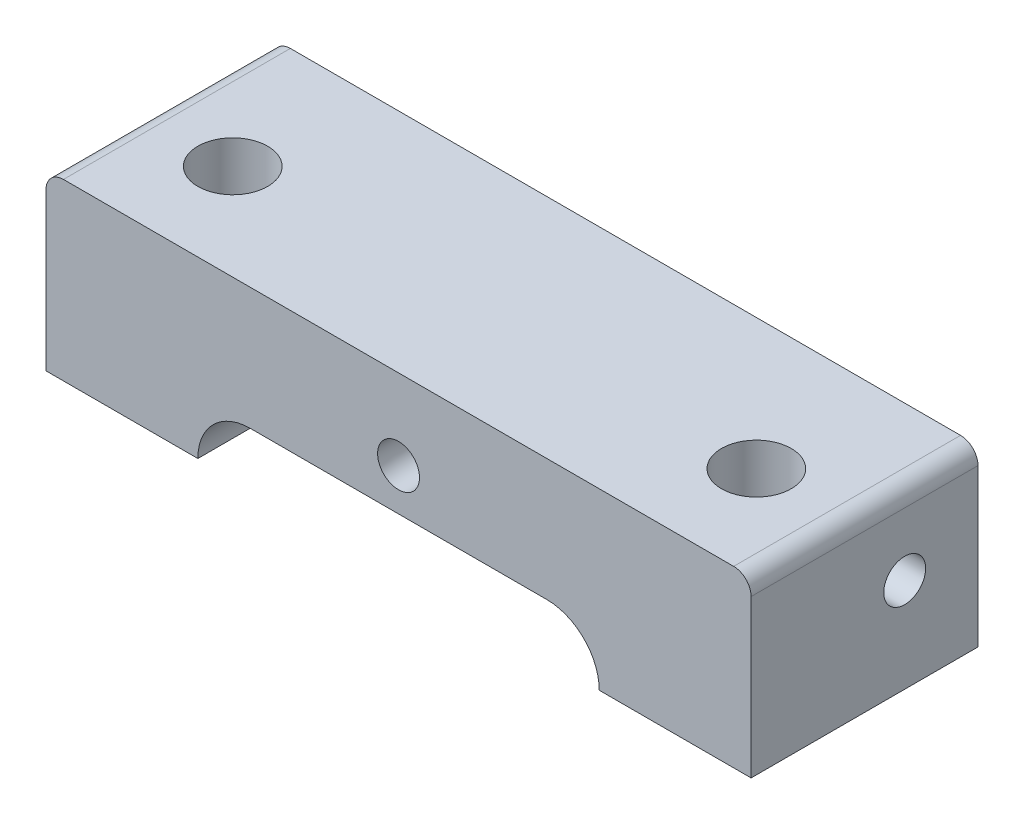
ISO-10303-21;
HEADER;
FILE_DESCRIPTION(('STEP AP214'),'2;1');
FILE_NAME('part.step','',(''),(''),'','','');
FILE_SCHEMA(('AUTOMOTIVE_DESIGN { 1 0 10303 214 1 1 1 1 }'));
ENDSEC;
DATA;
#1=APPLICATION_CONTEXT('core data for automotive mechanical design processes');
#2=APPLICATION_PROTOCOL_DEFINITION('international standard','automotive_design',2000,#1);
#3=PRODUCT_CONTEXT('',#1,'mechanical');
#4=PRODUCT('Part','Part','',(#3));
#5=PRODUCT_RELATED_PRODUCT_CATEGORY('part','',(#4));
#6=PRODUCT_DEFINITION_FORMATION('','',#4);
#7=PRODUCT_DEFINITION_CONTEXT('part definition',#1,'design');
#8=PRODUCT_DEFINITION('design','',#6,#7);
#9=PRODUCT_DEFINITION_SHAPE('','',#8);
#10=(LENGTH_UNIT() NAMED_UNIT(*) SI_UNIT(.MILLI.,.METRE.));
#11=(NAMED_UNIT(*) PLANE_ANGLE_UNIT() SI_UNIT($,.RADIAN.));
#12=(NAMED_UNIT(*) SI_UNIT($,.STERADIAN.) SOLID_ANGLE_UNIT());
#13=UNCERTAINTY_MEASURE_WITH_UNIT(LENGTH_MEASURE(1.E-05),#10,'distance_accuracy_value','');
#14=(GEOMETRIC_REPRESENTATION_CONTEXT(3) GLOBAL_UNCERTAINTY_ASSIGNED_CONTEXT((#13)) GLOBAL_UNIT_ASSIGNED_CONTEXT((#10,
#11,#12)) REPRESENTATION_CONTEXT('',''));
#15=CARTESIAN_POINT('',(0.,0.,0.));
#16=DIRECTION('',(0.,0.,1.));
#17=DIRECTION('',(1.,0.,0.));
#18=AXIS2_PLACEMENT_3D('',#15,#16,#17);
#19=CARTESIAN_POINT('',(0.,25.4,0.));
#20=DIRECTION('',(0.,1.,0.));
#21=DIRECTION('',(0.,0.,1.));
#22=AXIS2_PLACEMENT_3D('',#19,#20,#21);
#23=PLANE('',#22);
#24=CARTESIAN_POINT('',(9.525,25.4,0.635));
#25=DIRECTION('',(0.,1.,0.));
#26=DIRECTION('',(0.,0.,1.));
#27=AXIS2_PLACEMENT_3D('',#24,#25,#26);
#28=CIRCLE('',#27,1.27);
#29=CARTESIAN_POINT('',(9.525,25.4,1.905));
#30=VERTEX_POINT('',#29);
#31=EDGE_CURVE('E179',#30,#30,#28,.F.);
#32=ORIENTED_EDGE('',*,*,#31,.F.);
#33=EDGE_LOOP('',(#32));
#34=FACE_BOUND('',#33,.T.);
#35=DIRECTION('',(1.,0.,0.));
#36=VECTOR('',#35,1.);
#37=CARTESIAN_POINT('',(-12.827,25.4,4.1275));
#38=LINE('',#37,#36);
#39=CARTESIAN_POINT('',(7.3025,25.4,4.1275));
#40=VERTEX_POINT('',#39);
#41=CARTESIAN_POINT('',(12.827,25.4,4.1275));
#42=VERTEX_POINT('',#41);
#43=EDGE_CURVE('E187',#40,#42,#38,.T.);
#44=ORIENTED_EDGE('',*,*,#43,.F.);
#45=DIRECTION('',(0.,0.,-1.));
#46=VECTOR('',#45,1.);
#47=CARTESIAN_POINT('',(7.3025,25.4,21.2725));
#48=LINE('',#47,#46);
#49=CARTESIAN_POINT('',(7.3025,25.4,-4.1275));
#50=VERTEX_POINT('',#49);
#51=EDGE_CURVE('E182',#50,#40,#48,.F.);
#52=ORIENTED_EDGE('',*,*,#51,.F.);
#53=DIRECTION('',(-1.,0.,0.));
#54=VECTOR('',#53,1.);
#55=CARTESIAN_POINT('',(-12.827,25.4,-4.1275));
#56=LINE('',#55,#54);
#57=CARTESIAN_POINT('',(12.827,25.4,-4.1275));
#58=VERTEX_POINT('',#57);
#59=EDGE_CURVE('E41',#58,#50,#56,.T.);
#60=ORIENTED_EDGE('',*,*,#59,.F.);
#61=DIRECTION('',(0.,0.,-1.));
#62=VECTOR('',#61,1.);
#63=CARTESIAN_POINT('',(12.827,25.4,4.1275));
#64=LINE('',#63,#62);
#65=EDGE_CURVE('E11',#42,#58,#64,.T.);
#66=ORIENTED_EDGE('',*,*,#65,.F.);
#67=EDGE_LOOP('',(#44,#52,#60,#66));
#68=FACE_BOUND('',#67,.T.);
#69=ADVANCED_FACE('F32',(#34,#68),#23,.F.);
#70=CARTESIAN_POINT('',(-9.525,25.4,0.635));
#71=DIRECTION('',(0.,1.,0.));
#72=DIRECTION('',(0.,0.,1.));
#73=AXIS2_PLACEMENT_3D('',#70,#71,#72);
#74=CIRCLE('',#73,1.27);
#75=CARTESIAN_POINT('',(-9.525,25.4,1.905));
#76=VERTEX_POINT('',#75);
#77=EDGE_CURVE('E176',#76,#76,#74,.F.);
#78=ORIENTED_EDGE('',*,*,#77,.F.);
#79=EDGE_LOOP('',(#78));
#80=FACE_BOUND('',#79,.T.);
#81=DIRECTION('',(0.,0.,-1.));
#82=VECTOR('',#81,1.);
#83=CARTESIAN_POINT('',(-7.3025,25.4,21.2725));
#84=LINE('',#83,#82);
#85=CARTESIAN_POINT('',(-7.3025,25.4,4.1275));
#86=VERTEX_POINT('',#85);
#87=CARTESIAN_POINT('',(-7.3025,25.4,-4.1275));
#88=VERTEX_POINT('',#87);
#89=EDGE_CURVE('E184',#86,#88,#84,.T.);
#90=ORIENTED_EDGE('',*,*,#89,.F.);
#91=CARTESIAN_POINT('',(-12.827,25.4,4.1275));
#92=VERTEX_POINT('',#91);
#93=EDGE_CURVE('E185',#92,#86,#38,.T.);
#94=ORIENTED_EDGE('',*,*,#93,.F.);
#95=DIRECTION('',(0.,0.,1.));
#96=VECTOR('',#95,1.);
#97=CARTESIAN_POINT('',(-12.827,25.4,4.1275));
#98=LINE('',#97,#96);
#99=CARTESIAN_POINT('',(-12.827,25.4,-4.1275));
#100=VERTEX_POINT('',#99);
#101=EDGE_CURVE('E36',#100,#92,#98,.T.);
#102=ORIENTED_EDGE('',*,*,#101,.F.);
#103=EDGE_CURVE('E55',#88,#100,#56,.T.);
#104=ORIENTED_EDGE('',*,*,#103,.F.);
#105=EDGE_LOOP('',(#90,#94,#102,#104));
#106=FACE_BOUND('',#105,.T.);
#107=ADVANCED_FACE('F34',(#80,#106),#23,.F.);
#108=CARTESIAN_POINT('',(-12.828,28.829,-1.4605));
#109=DIRECTION('',(1.,0.,0.));
#110=DIRECTION('',(0.,0.,-1.));
#111=AXIS2_PLACEMENT_3D('',#108,#109,#110);
#112=CYLINDRICAL_SURFACE('',#111,0.762);
#113=CARTESIAN_POINT('',(5.58800000000002,28.829,-1.4605));
#114=DIRECTION('',(-1.,0.,0.));
#115=DIRECTION('',(0.,0.,1.));
#116=AXIS2_PLACEMENT_3D('',#113,#114,#115);
#117=CIRCLE('',#116,0.762);
#118=CARTESIAN_POINT('',(5.58800000000002,28.829,-2.2225));
#119=VERTEX_POINT('',#118);
#120=EDGE_CURVE('E221',#119,#119,#117,.F.);
#121=CARTESIAN_POINT('',(12.827,28.829,-1.4605));
#122=DIRECTION('',(1.,0.,0.));
#123=DIRECTION('',(0.,0.,-1.));
#124=AXIS2_PLACEMENT_3D('',#121,#122,#123);
#125=CIRCLE('',#124,0.762);
#126=CARTESIAN_POINT('',(12.827,28.829,-2.2225));
#127=VERTEX_POINT('',#126);
#128=EDGE_CURVE('E224',#127,#127,#125,.T.);
#129=CARTESIAN_POINT('',(5.58800000000002,28.829,-2.2225));
#130=CARTESIAN_POINT('',(5.66340625000003,28.829,-2.2225));
#131=CARTESIAN_POINT('',(5.73881250000002,28.829,-2.2225));
#132=CARTESIAN_POINT('',(5.88962500000003,28.829,-2.2225));
#133=CARTESIAN_POINT('',(5.96503125000002,28.829,-2.2225));
#134=CARTESIAN_POINT('',(6.11584375000002,28.829,-2.2225));
#135=CARTESIAN_POINT('',(6.19125000000002,28.829,-2.2225));
#136=CARTESIAN_POINT('',(6.34206250000002,28.829,-2.2225));
#137=CARTESIAN_POINT('',(6.41746875000002,28.829,-2.2225));
#138=CARTESIAN_POINT('',(6.56828125000002,28.829,-2.2225));
#139=CARTESIAN_POINT('',(6.64368750000002,28.829,-2.2225));
#140=CARTESIAN_POINT('',(6.79450000000002,28.829,-2.2225));
#141=CARTESIAN_POINT('',(6.86990625000002,28.829,-2.2225));
#142=CARTESIAN_POINT('',(7.02071875000002,28.829,-2.2225));
#143=CARTESIAN_POINT('',(7.09612500000002,28.829,-2.2225));
#144=CARTESIAN_POINT('',(7.24693750000002,28.829,-2.2225));
#145=CARTESIAN_POINT('',(7.32234375000002,28.829,-2.2225));
#146=CARTESIAN_POINT('',(7.47315625000002,28.829,-2.2225));
#147=CARTESIAN_POINT('',(7.54856250000002,28.829,-2.2225));
#148=CARTESIAN_POINT('',(7.69937500000002,28.829,-2.2225));
#149=CARTESIAN_POINT('',(7.77478125000002,28.829,-2.2225));
#150=CARTESIAN_POINT('',(7.92559375000002,28.829,-2.2225));
#151=CARTESIAN_POINT('',(8.00100000000002,28.829,-2.2225));
#152=CARTESIAN_POINT('',(8.15181250000001,28.829,-2.2225));
#153=CARTESIAN_POINT('',(8.22721875000001,28.829,-2.2225));
#154=CARTESIAN_POINT('',(8.37803125000001,28.829,-2.2225));
#155=CARTESIAN_POINT('',(8.45343750000001,28.829,-2.2225));
#156=CARTESIAN_POINT('',(8.60425000000001,28.829,-2.2225));
#157=CARTESIAN_POINT('',(8.67965625000001,28.829,-2.2225));
#158=CARTESIAN_POINT('',(8.83046875000001,28.829,-2.2225));
#159=CARTESIAN_POINT('',(8.90587500000001,28.829,-2.2225));
#160=CARTESIAN_POINT('',(9.05668750000001,28.829,-2.2225));
#161=CARTESIAN_POINT('',(9.13209375000001,28.829,-2.2225));
#162=CARTESIAN_POINT('',(9.28290625000001,28.829,-2.2225));
#163=CARTESIAN_POINT('',(9.35831250000001,28.829,-2.2225));
#164=CARTESIAN_POINT('',(9.50912500000001,28.829,-2.2225));
#165=CARTESIAN_POINT('',(9.58453125000001,28.829,-2.2225));
#166=CARTESIAN_POINT('',(9.73534375000001,28.829,-2.2225));
#167=CARTESIAN_POINT('',(9.81075000000001,28.829,-2.2225));
#168=CARTESIAN_POINT('',(9.9615625,28.829,-2.2225));
#169=CARTESIAN_POINT('',(10.03696875,28.829,-2.2225));
#170=CARTESIAN_POINT('',(10.18778125,28.829,-2.2225));
#171=CARTESIAN_POINT('',(10.2631875,28.829,-2.2225));
#172=CARTESIAN_POINT('',(10.414,28.829,-2.2225));
#173=CARTESIAN_POINT('',(10.48940625,28.829,-2.2225));
#174=CARTESIAN_POINT('',(10.64021875,28.829,-2.2225));
#175=CARTESIAN_POINT('',(10.715625,28.829,-2.2225));
#176=CARTESIAN_POINT('',(10.8664375,28.829,-2.2225));
#177=CARTESIAN_POINT('',(10.94184375,28.829,-2.2225));
#178=CARTESIAN_POINT('',(11.09265625,28.829,-2.2225));
#179=CARTESIAN_POINT('',(11.1680625,28.829,-2.2225));
#180=CARTESIAN_POINT('',(11.318875,28.829,-2.2225));
#181=CARTESIAN_POINT('',(11.39428125,28.829,-2.2225));
#182=CARTESIAN_POINT('',(11.54509375,28.829,-2.2225));
#183=CARTESIAN_POINT('',(11.6205,28.829,-2.2225));
#184=CARTESIAN_POINT('',(11.7713125,28.829,-2.2225));
#185=CARTESIAN_POINT('',(11.84671875,28.829,-2.2225));
#186=CARTESIAN_POINT('',(11.99753125,28.829,-2.2225));
#187=CARTESIAN_POINT('',(12.0729375,28.829,-2.2225));
#188=CARTESIAN_POINT('',(12.22375,28.829,-2.2225));
#189=CARTESIAN_POINT('',(12.29915625,28.829,-2.2225));
#190=CARTESIAN_POINT('',(12.44996875,28.829,-2.2225));
#191=CARTESIAN_POINT('',(12.525375,28.829,-2.2225));
#192=CARTESIAN_POINT('',(12.6761875,28.829,-2.2225));
#193=CARTESIAN_POINT('',(12.75159375,28.829,-2.2225));
#194=CARTESIAN_POINT('',(12.827,28.829,-2.2225));
#195=B_SPLINE_CURVE_WITH_KNOTS('',3,(#129,#130,#131,#132,#133,#134,#135,#136,#137,#138,#139,
#140,#141,#142,#143,#144,#145,#146,#147,#148,#149,#150,#151,#152,#153,#154,#155,#156,#157,#158,
#159,#160,#161,#162,#163,#164,#165,#166,#167,#168,#169,#170,#171,#172,#173,#174,#175,#176,#177,
#178,#179,#180,#181,#182,#183,#184,#185,#186,#187,#188,#189,#190,#191,#192,#193,#194),
.UNSPECIFIED.,.F.,.F.,(4,2,2,2,2,2,2,2,2,2,2,2,2,2,2,2,2,2,2,2,2,2,2,2,2,2,2,2,2,2,2,2,4),(0.,
0.22621875,0.4524375,0.678656249999996,0.904874999999996,1.13109375,1.35731249999999,
1.58353124999999,1.80974999999999,2.03596874999999,2.26218749999999,2.48840624999999,
2.71462499999999,2.94084374999999,3.16706249999998,3.39328124999998,3.61949999999998,
3.84571874999998,4.07193749999998,4.29815624999998,4.52437499999998,4.75059374999998,
4.97681249999998,5.20303124999998,5.42924999999998,5.65546874999998,5.88168749999998,
6.10790624999997,6.33412499999997,6.56034374999997,6.78656249999997,7.01278124999997,
7.23899999999997),.UNSPECIFIED.);
#196=EDGE_CURVE('BSEAM259',#119,#127,#195,.T.);
#197=ORIENTED_EDGE('',*,*,#120,.F.);
#198=ORIENTED_EDGE('',*,*,#128,.T.);
#199=ORIENTED_EDGE('',*,*,#196,.T.);
#200=ORIENTED_EDGE('',*,*,#196,.F.);
#201=EDGE_LOOP('',(#197,#199,#198,#200));
#202=FACE_BOUND('',#201,.T.);
#203=ADVANCED_FACE('F259',(#202),#112,.F.);
#204=CARTESIAN_POINT('',(-12.192,31.115,0.));
#205=DIRECTION('',(0.,0.,1.));
#206=DIRECTION('',(1.,0.,0.));
#207=AXIS2_PLACEMENT_3D('',#204,#205,#206);
#208=CYLINDRICAL_SURFACE('',#207,0.635);
#209=CARTESIAN_POINT('',(-12.192,31.115,-4.1275));
#210=DIRECTION('',(0.,0.,1.));
#211=DIRECTION('',(1.,0.,0.));
#212=AXIS2_PLACEMENT_3D('',#209,#210,#211);
#213=CIRCLE('',#212,0.635);
#214=CARTESIAN_POINT('',(-12.827,31.115,-4.1275));
#215=VERTEX_POINT('',#214);
#216=CARTESIAN_POINT('',(-12.192,31.75,-4.1275));
#217=VERTEX_POINT('',#216);
#218=EDGE_CURVE('E172',#215,#217,#213,.F.);
#219=ORIENTED_EDGE('',*,*,#218,.F.);
#220=DIRECTION('',(0.,0.,1.));
#221=VECTOR('',#220,1.);
#222=CARTESIAN_POINT('',(-12.827,31.115,4.1275));
#223=LINE('',#222,#221);
#224=CARTESIAN_POINT('',(-12.827,31.115,4.1275));
#225=VERTEX_POINT('',#224);
#226=EDGE_CURVE('E168',#225,#215,#223,.F.);
#227=ORIENTED_EDGE('',*,*,#226,.F.);
#228=CARTESIAN_POINT('',(-12.192,31.115,4.1275));
#229=DIRECTION('',(0.,0.,-1.));
#230=DIRECTION('',(-1.,0.,0.));
#231=AXIS2_PLACEMENT_3D('',#228,#229,#230);
#232=CIRCLE('',#231,0.635);
#233=CARTESIAN_POINT('',(-12.192,31.75,4.1275));
#234=VERTEX_POINT('',#233);
#235=EDGE_CURVE('E166',#234,#225,#232,.F.);
#236=ORIENTED_EDGE('',*,*,#235,.F.);
#237=DIRECTION('',(0.,0.,1.));
#238=VECTOR('',#237,1.);
#239=CARTESIAN_POINT('',(-12.192,31.75,0.));
#240=LINE('',#239,#238);
#241=EDGE_CURVE('E161',#217,#234,#240,.T.);
#242=ORIENTED_EDGE('',*,*,#241,.F.);
#243=EDGE_LOOP('',(#219,#227,#236,#242));
#244=FACE_BOUND('',#243,.T.);
#245=ADVANCED_FACE('F211',(#244),#208,.T.);
#246=CARTESIAN_POINT('',(0.,31.75,0.));
#247=DIRECTION('',(0.,-1.,0.));
#248=DIRECTION('',(0.,0.,-1.));
#249=AXIS2_PLACEMENT_3D('',#246,#247,#248);
#250=PLANE('',#249);
#251=CARTESIAN_POINT('',(-9.525,31.75,0.635));
#252=DIRECTION('',(0.,1.,0.));
#253=DIRECTION('',(0.,0.,1.));
#254=AXIS2_PLACEMENT_3D('',#251,#252,#253);
#255=CIRCLE('',#254,1.27);
#256=CARTESIAN_POINT('',(-9.525,31.75,1.905));
#257=VERTEX_POINT('',#256);
#258=EDGE_CURVE('E232',#257,#257,#255,.T.);
#259=ORIENTED_EDGE('',*,*,#258,.F.);
#260=EDGE_LOOP('',(#259));
#261=FACE_BOUND('',#260,.T.);
#262=CARTESIAN_POINT('',(9.525,31.75,0.635));
#263=DIRECTION('',(0.,1.,0.));
#264=DIRECTION('',(0.,0.,1.));
#265=AXIS2_PLACEMENT_3D('',#262,#263,#264);
#266=CIRCLE('',#265,1.27);
#267=CARTESIAN_POINT('',(9.525,31.75,1.905));
#268=VERTEX_POINT('',#267);
#269=EDGE_CURVE('E227',#268,#268,#266,.T.);
#270=ORIENTED_EDGE('',*,*,#269,.F.);
#271=EDGE_LOOP('',(#270));
#272=FACE_BOUND('',#271,.T.);
#273=DIRECTION('',(-1.,0.,0.));
#274=VECTOR('',#273,1.);
#275=CARTESIAN_POINT('',(-12.827,31.75,-4.1275));
#276=LINE('',#275,#274);
#277=CARTESIAN_POINT('',(12.192,31.75,-4.1275));
#278=VERTEX_POINT('',#277);
#279=EDGE_CURVE('E121',#278,#217,#276,.T.);
#280=ORIENTED_EDGE('',*,*,#279,.T.);
#281=ORIENTED_EDGE('',*,*,#241,.T.);
#282=DIRECTION('',(1.,0.,0.));
#283=VECTOR('',#282,1.);
#284=CARTESIAN_POINT('',(-12.827,31.75,4.1275));
#285=LINE('',#284,#283);
#286=CARTESIAN_POINT('',(12.192,31.75,4.1275));
#287=VERTEX_POINT('',#286);
#288=EDGE_CURVE('E140',#234,#287,#285,.T.);
#289=ORIENTED_EDGE('',*,*,#288,.T.);
#290=DIRECTION('',(0.,0.,-1.));
#291=VECTOR('',#290,1.);
#292=CARTESIAN_POINT('',(12.192,31.75,0.));
#293=LINE('',#292,#291);
#294=EDGE_CURVE('E158',#287,#278,#293,.T.);
#295=ORIENTED_EDGE('',*,*,#294,.T.);
#296=EDGE_LOOP('',(#280,#281,#289,#295));
#297=FACE_BOUND('',#296,.T.);
#298=ADVANCED_FACE('F206',(#261,#272,#297),#250,.F.);
#299=CARTESIAN_POINT('',(-9.525,19.05,0.635));
#300=DIRECTION('',(0.,1.,0.));
#301=DIRECTION('',(0.,0.,1.));
#302=AXIS2_PLACEMENT_3D('',#299,#300,#301);
#303=CYLINDRICAL_SURFACE('',#302,1.27);
#304=ORIENTED_EDGE('',*,*,#77,.T.);
#305=EDGE_LOOP('',(#304));
#306=FACE_BOUND('',#305,.T.);
#307=ORIENTED_EDGE('',*,*,#258,.T.);
#308=EDGE_LOOP('',(#307));
#309=FACE_BOUND('',#308,.T.);
#310=ADVANCED_FACE('F236',(#306,#309),#303,.F.);
#311=CARTESIAN_POINT('',(9.525,19.05,0.635));
#312=DIRECTION('',(0.,1.,0.));
#313=DIRECTION('',(0.,0.,1.));
#314=AXIS2_PLACEMENT_3D('',#311,#312,#313);
#315=CYLINDRICAL_SURFACE('',#314,1.27);
#316=ORIENTED_EDGE('',*,*,#31,.T.);
#317=EDGE_LOOP('',(#316));
#318=FACE_BOUND('',#317,.T.);
#319=ORIENTED_EDGE('',*,*,#269,.T.);
#320=EDGE_LOOP('',(#319));
#321=FACE_BOUND('',#320,.T.);
#322=ADVANCED_FACE('F243',(#318,#321),#315,.F.);
#323=CARTESIAN_POINT('',(12.192,31.115,0.));
#324=DIRECTION('',(0.,0.,-1.));
#325=DIRECTION('',(-1.,0.,0.));
#326=AXIS2_PLACEMENT_3D('',#323,#324,#325);
#327=CYLINDRICAL_SURFACE('',#326,0.635);
#328=CARTESIAN_POINT('',(12.192,31.115,4.1275));
#329=DIRECTION('',(0.,0.,-1.));
#330=DIRECTION('',(-1.,0.,0.));
#331=AXIS2_PLACEMENT_3D('',#328,#329,#330);
#332=CIRCLE('',#331,0.635);
#333=CARTESIAN_POINT('',(12.827,31.115,4.1275));
#334=VERTEX_POINT('',#333);
#335=EDGE_CURVE('E164',#334,#287,#332,.F.);
#336=ORIENTED_EDGE('',*,*,#335,.F.);
#337=DIRECTION('',(0.,0.,-1.));
#338=VECTOR('',#337,1.);
#339=CARTESIAN_POINT('',(12.827,31.115,4.1275));
#340=LINE('',#339,#338);
#341=CARTESIAN_POINT('',(12.827,31.115,-4.1275));
#342=VERTEX_POINT('',#341);
#343=EDGE_CURVE('E174',#342,#334,#340,.F.);
#344=ORIENTED_EDGE('',*,*,#343,.F.);
#345=CARTESIAN_POINT('',(12.192,31.115,-4.1275));
#346=DIRECTION('',(0.,0.,1.));
#347=DIRECTION('',(1.,0.,0.));
#348=AXIS2_PLACEMENT_3D('',#345,#346,#347);
#349=CIRCLE('',#348,0.635);
#350=EDGE_CURVE('E170',#278,#342,#349,.F.);
#351=ORIENTED_EDGE('',*,*,#350,.F.);
#352=ORIENTED_EDGE('',*,*,#294,.F.);
#353=EDGE_LOOP('',(#336,#344,#351,#352));
#354=FACE_BOUND('',#353,.T.);
#355=ADVANCED_FACE('F202',(#354),#327,.T.);
#356=CARTESIAN_POINT('',(12.827,31.75,4.1275));
#357=DIRECTION('',(-1.,0.,0.));
#358=DIRECTION('',(0.,0.,1.));
#359=AXIS2_PLACEMENT_3D('',#356,#357,#358);
#360=PLANE('',#359);
#361=ORIENTED_EDGE('',*,*,#128,.F.);
#362=EDGE_LOOP('',(#361));
#363=FACE_BOUND('',#362,.T.);
#364=DIRECTION('',(0.,-1.,0.));
#365=VECTOR('',#364,1.);
#366=CARTESIAN_POINT('',(12.827,31.75,4.1275));
#367=LINE('',#366,#365);
#368=EDGE_CURVE('E143',#334,#42,#367,.T.);
#369=ORIENTED_EDGE('',*,*,#368,.T.);
#370=ORIENTED_EDGE('',*,*,#65,.T.);
#371=DIRECTION('',(0.,-1.,0.));
#372=VECTOR('',#371,1.);
#373=CARTESIAN_POINT('',(12.827,31.75,-4.1275));
#374=LINE('',#373,#372);
#375=EDGE_CURVE('E151',#342,#58,#374,.T.);
#376=ORIENTED_EDGE('',*,*,#375,.F.);
#377=ORIENTED_EDGE('',*,*,#343,.T.);
#378=EDGE_LOOP('',(#369,#370,#376,#377));
#379=FACE_BOUND('',#378,.T.);
#380=ADVANCED_FACE('F199',(#363,#379),#360,.F.);
#381=CARTESIAN_POINT('',(-12.827,31.75,4.1275));
#382=DIRECTION('',(1.,0.,0.));
#383=DIRECTION('',(0.,0.,-1.));
#384=AXIS2_PLACEMENT_3D('',#381,#382,#383);
#385=PLANE('',#384);
#386=DIRECTION('',(0.,-1.,0.));
#387=VECTOR('',#386,1.);
#388=CARTESIAN_POINT('',(-12.827,31.75,-4.1275));
#389=LINE('',#388,#387);
#390=EDGE_CURVE('E148',#215,#100,#389,.T.);
#391=ORIENTED_EDGE('',*,*,#390,.T.);
#392=ORIENTED_EDGE('',*,*,#101,.T.);
#393=DIRECTION('',(0.,-1.,0.));
#394=VECTOR('',#393,1.);
#395=CARTESIAN_POINT('',(-12.827,31.75,4.1275));
#396=LINE('',#395,#394);
#397=EDGE_CURVE('E145',#225,#92,#396,.T.);
#398=ORIENTED_EDGE('',*,*,#397,.F.);
#399=ORIENTED_EDGE('',*,*,#226,.T.);
#400=EDGE_LOOP('',(#391,#392,#398,#399));
#401=FACE_BOUND('',#400,.T.);
#402=ADVANCED_FACE('F215',(#401),#385,.F.);
#403=CARTESIAN_POINT('',(5.588,28.829,4.1275));
#404=DIRECTION('',(0.,1.,0.));
#405=DIRECTION('',(0.,0.,1.));
#406=AXIS2_PLACEMENT_3D('',#403,#404,#405);
#407=TOROIDAL_SURFACE('',#406,5.588,0.762);
#408=CARTESIAN_POINT('',(0.,28.829,4.1275));
#409=DIRECTION('',(0.,0.,1.));
#410=DIRECTION('',(1.,0.,0.));
#411=AXIS2_PLACEMENT_3D('',#408,#409,#410);
#412=CIRCLE('',#411,0.762);
#413=CARTESIAN_POINT('',(-0.761999999999999,28.829,4.1275));
#414=VERTEX_POINT('',#413);
#415=EDGE_CURVE('E219',#414,#414,#412,.T.);
#416=CARTESIAN_POINT('',(5.588,28.829,4.1275));
#417=DIRECTION('',(0.,1.,0.));
#418=DIRECTION('',(0.,0.,1.));
#419=AXIS2_PLACEMENT_3D('',#416,#417,#418);
#420=CIRCLE('',#419,6.35);
#421=EDGE_CURVE('',#119,#414,#420,.T.);
#422=ORIENTED_EDGE('',*,*,#120,.T.);
#423=ORIENTED_EDGE('',*,*,#415,.T.);
#424=ORIENTED_EDGE('',*,*,#421,.T.);
#425=ORIENTED_EDGE('',*,*,#421,.F.);
#426=EDGE_LOOP('',(#422,#424,#423,#425));
#427=FACE_BOUND('',#426,.T.);
#428=ADVANCED_FACE('F280',(#427),#407,.F.);
#429=CARTESIAN_POINT('',(-5.3975,27.305,21.2725));
#430=DIRECTION('',(0.,1.,0.));
#431=DIRECTION('',(-1.,0.,0.));
#432=AXIS2_PLACEMENT_3D('',#429,#430,#431);
#433=PLANE('',#432);
#434=DIRECTION('',(0.,0.,-1.));
#435=VECTOR('',#434,1.);
#436=CARTESIAN_POINT('',(-5.3975,27.305,21.2725));
#437=LINE('',#436,#435);
#438=CARTESIAN_POINT('',(-5.3975,27.305,4.1275));
#439=VERTEX_POINT('',#438);
#440=CARTESIAN_POINT('',(-5.3975,27.305,-4.1275));
#441=VERTEX_POINT('',#440);
#442=EDGE_CURVE('E122',#439,#441,#437,.T.);
#443=ORIENTED_EDGE('',*,*,#442,.T.);
#444=DIRECTION('',(1.,0.,0.));
#445=VECTOR('',#444,1.);
#446=CARTESIAN_POINT('',(-5.3975,27.305,-4.1275));
#447=LINE('',#446,#445);
#448=CARTESIAN_POINT('',(5.3975,27.305,-4.1275));
#449=VERTEX_POINT('',#448);
#450=EDGE_CURVE('E126',#441,#449,#447,.T.);
#451=ORIENTED_EDGE('',*,*,#450,.T.);
#452=DIRECTION('',(0.,0.,-1.));
#453=VECTOR('',#452,1.);
#454=CARTESIAN_POINT('',(5.3975,27.305,21.2725));
#455=LINE('',#454,#453);
#456=CARTESIAN_POINT('',(5.3975,27.305,4.1275));
#457=VERTEX_POINT('',#456);
#458=EDGE_CURVE('E111',#457,#449,#455,.T.);
#459=ORIENTED_EDGE('',*,*,#458,.F.);
#460=DIRECTION('',(1.,0.,0.));
#461=VECTOR('',#460,1.);
#462=CARTESIAN_POINT('',(-12.827,27.305,4.1275));
#463=LINE('',#462,#461);
#464=EDGE_CURVE('E153',#439,#457,#463,.T.);
#465=ORIENTED_EDGE('',*,*,#464,.F.);
#466=EDGE_LOOP('',(#443,#451,#459,#465));
#467=FACE_BOUND('',#466,.T.);
#468=ADVANCED_FACE('F127',(#467),#433,.F.);
#469=CARTESIAN_POINT('',(-12.827,31.75,4.1275));
#470=DIRECTION('',(0.,0.,-1.));
#471=DIRECTION('',(-1.,0.,0.));
#472=AXIS2_PLACEMENT_3D('',#469,#470,#471);
#473=PLANE('',#472);
#474=ORIENTED_EDGE('',*,*,#415,.F.);
#475=EDGE_LOOP('',(#474));
#476=FACE_BOUND('',#475,.T.);
#477=ORIENTED_EDGE('',*,*,#397,.T.);
#478=ORIENTED_EDGE('',*,*,#93,.T.);
#479=CARTESIAN_POINT('',(-5.3975,25.4,4.1275));
#480=DIRECTION('',(0.,0.,-1.));
#481=DIRECTION('',(-1.,0.,0.));
#482=AXIS2_PLACEMENT_3D('',#479,#480,#481);
#483=CIRCLE('',#482,1.905);
#484=EDGE_CURVE('E156',#86,#439,#483,.T.);
#485=ORIENTED_EDGE('',*,*,#484,.T.);
#486=ORIENTED_EDGE('',*,*,#464,.T.);
#487=CARTESIAN_POINT('',(5.3975,25.4,4.1275));
#488=DIRECTION('',(0.,0.,-1.));
#489=DIRECTION('',(-1.,0.,0.));
#490=AXIS2_PLACEMENT_3D('',#487,#488,#489);
#491=CIRCLE('',#490,1.905);
#492=EDGE_CURVE('E117',#457,#40,#491,.T.);
#493=ORIENTED_EDGE('',*,*,#492,.T.);
#494=ORIENTED_EDGE('',*,*,#43,.T.);
#495=ORIENTED_EDGE('',*,*,#368,.F.);
#496=ORIENTED_EDGE('',*,*,#335,.T.);
#497=ORIENTED_EDGE('',*,*,#288,.F.);
#498=ORIENTED_EDGE('',*,*,#235,.T.);
#499=EDGE_LOOP('',(#477,#478,#485,#486,#493,#494,#495,#496,#497,#498));
#500=FACE_BOUND('',#499,.T.);
#501=ADVANCED_FACE('F196',(#476,#500),#473,.F.);
#502=CARTESIAN_POINT('',(-12.827,31.75,-4.1275));
#503=DIRECTION('',(0.,0.,1.));
#504=DIRECTION('',(1.,0.,0.));
#505=AXIS2_PLACEMENT_3D('',#502,#503,#504);
#506=PLANE('',#505);
#507=ORIENTED_EDGE('',*,*,#375,.T.);
#508=ORIENTED_EDGE('',*,*,#59,.T.);
#509=CARTESIAN_POINT('',(5.3975,25.4,-4.1275));
#510=DIRECTION('',(0.,0.,-1.));
#511=DIRECTION('',(-1.,0.,0.));
#512=AXIS2_PLACEMENT_3D('',#509,#510,#511);
#513=CIRCLE('',#512,1.905);
#514=EDGE_CURVE('E115',#449,#50,#513,.T.);
#515=ORIENTED_EDGE('',*,*,#514,.F.);
#516=ORIENTED_EDGE('',*,*,#450,.F.);
#517=CARTESIAN_POINT('',(-5.3975,25.4,-4.1275));
#518=DIRECTION('',(0.,0.,-1.));
#519=DIRECTION('',(-1.,0.,0.));
#520=AXIS2_PLACEMENT_3D('',#517,#518,#519);
#521=CIRCLE('',#520,1.905);
#522=EDGE_CURVE('E129',#88,#441,#521,.T.);
#523=ORIENTED_EDGE('',*,*,#522,.F.);
#524=ORIENTED_EDGE('',*,*,#103,.T.);
#525=ORIENTED_EDGE('',*,*,#390,.F.);
#526=ORIENTED_EDGE('',*,*,#218,.T.);
#527=ORIENTED_EDGE('',*,*,#279,.F.);
#528=ORIENTED_EDGE('',*,*,#350,.T.);
#529=EDGE_LOOP('',(#507,#508,#515,#516,#523,#524,#525,#526,#527,#528));
#530=FACE_BOUND('',#529,.T.);
#531=ADVANCED_FACE('F132',(#530),#506,.F.);
#532=CARTESIAN_POINT('',(5.3975,25.4,21.2725));
#533=DIRECTION('',(0.,0.,-1.));
#534=DIRECTION('',(-1.,0.,0.));
#535=AXIS2_PLACEMENT_3D('',#532,#533,#534);
#536=CYLINDRICAL_SURFACE('',#535,1.905);
#537=ORIENTED_EDGE('',*,*,#514,.T.);
#538=ORIENTED_EDGE('',*,*,#51,.T.);
#539=ORIENTED_EDGE('',*,*,#492,.F.);
#540=ORIENTED_EDGE('',*,*,#458,.T.);
#541=EDGE_LOOP('',(#537,#538,#539,#540));
#542=FACE_BOUND('',#541,.T.);
#543=ADVANCED_FACE('F113',(#542),#536,.F.);
#544=CARTESIAN_POINT('',(-5.3975,25.4,21.2725));
#545=DIRECTION('',(0.,0.,-1.));
#546=DIRECTION('',(-1.,0.,0.));
#547=AXIS2_PLACEMENT_3D('',#544,#545,#546);
#548=CYLINDRICAL_SURFACE('',#547,1.905);
#549=ORIENTED_EDGE('',*,*,#484,.F.);
#550=ORIENTED_EDGE('',*,*,#89,.T.);
#551=ORIENTED_EDGE('',*,*,#522,.T.);
#552=ORIENTED_EDGE('',*,*,#442,.F.);
#553=EDGE_LOOP('',(#549,#550,#551,#552));
#554=FACE_BOUND('',#553,.T.);
#555=ADVANCED_FACE('F218',(#554),#548,.F.);
#556=CLOSED_SHELL('',(#69,#107,#203,#245,#298,#310,#322,#355,#380,#402,#428,#468,#501,#531,#543,#555));
#557=MANIFOLD_SOLID_BREP('B2',#556);
#558=ADVANCED_BREP_SHAPE_REPRESENTATION('',(#18,#557),#14);
#559=SHAPE_DEFINITION_REPRESENTATION(#9,#558);
ENDSEC;
END-ISO-10303-21;
